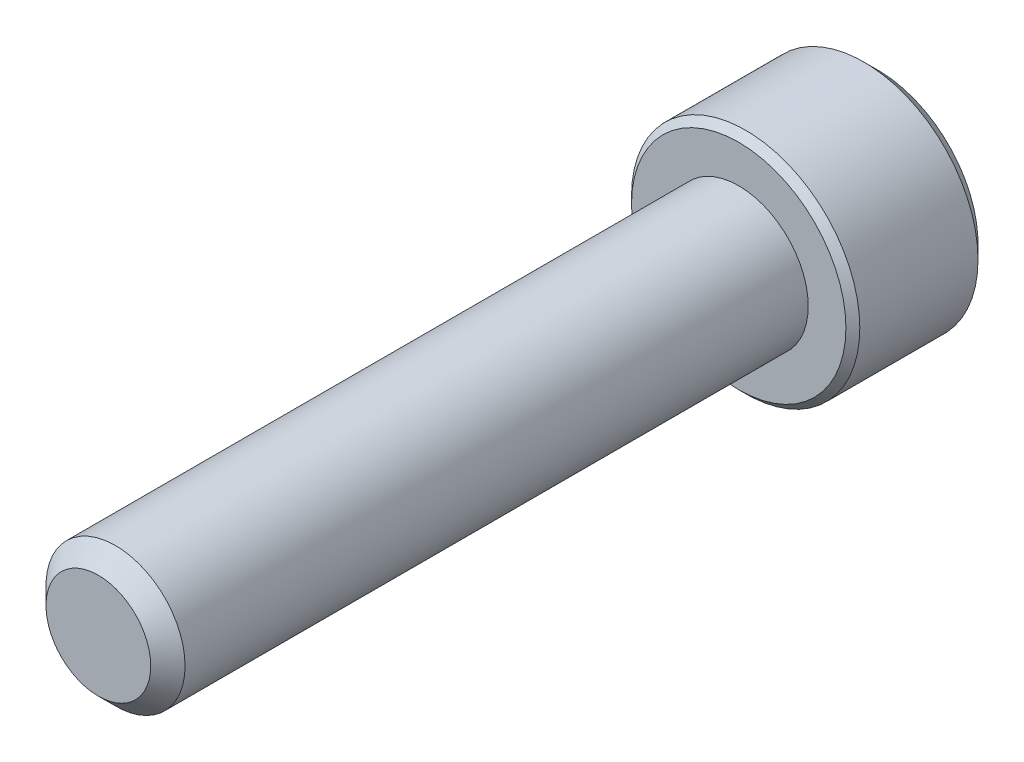
ISO-10303-21;
HEADER;
FILE_DESCRIPTION(('STEP AP214'),'2;1');
FILE_NAME('part.step','',(''),(''),'','','');
FILE_SCHEMA(('AUTOMOTIVE_DESIGN { 1 0 10303 214 1 1 1 1 }'));
ENDSEC;
DATA;
#1=APPLICATION_CONTEXT('core data for automotive mechanical design processes');
#2=APPLICATION_PROTOCOL_DEFINITION('international standard','automotive_design',2000,#1);
#3=PRODUCT_CONTEXT('',#1,'mechanical');
#4=PRODUCT('Part','Part','',(#3));
#5=PRODUCT_RELATED_PRODUCT_CATEGORY('part','',(#4));
#6=PRODUCT_DEFINITION_FORMATION('','',#4);
#7=PRODUCT_DEFINITION_CONTEXT('part definition',#1,'design');
#8=PRODUCT_DEFINITION('design','',#6,#7);
#9=PRODUCT_DEFINITION_SHAPE('','',#8);
#10=(LENGTH_UNIT() NAMED_UNIT(*) SI_UNIT(.MILLI.,.METRE.));
#11=(NAMED_UNIT(*) PLANE_ANGLE_UNIT() SI_UNIT($,.RADIAN.));
#12=(NAMED_UNIT(*) SI_UNIT($,.STERADIAN.) SOLID_ANGLE_UNIT());
#13=UNCERTAINTY_MEASURE_WITH_UNIT(LENGTH_MEASURE(1.E-05),#10,'distance_accuracy_value','');
#14=(GEOMETRIC_REPRESENTATION_CONTEXT(3) GLOBAL_UNCERTAINTY_ASSIGNED_CONTEXT((#13)) GLOBAL_UNIT_ASSIGNED_CONTEXT((#10,
#11,#12)) REPRESENTATION_CONTEXT('',''));
#15=CARTESIAN_POINT('',(0.,0.,0.));
#16=DIRECTION('',(0.,0.,1.));
#17=DIRECTION('',(1.,0.,0.));
#18=AXIS2_PLACEMENT_3D('',#15,#16,#17);
#19=CARTESIAN_POINT('',(0.,0.,-22.225));
#20=DIRECTION('',(0.,0.,1.));
#21=DIRECTION('',(1.,0.,0.));
#22=AXIS2_PLACEMENT_3D('',#19,#20,#21);
#23=CYLINDRICAL_SURFACE('',#22,2.413);
#24=CARTESIAN_POINT('',(0.,0.,-0.5953125));
#25=DIRECTION('',(0.,0.,1.));
#26=DIRECTION('',(1.,0.,0.));
#27=AXIS2_PLACEMENT_3D('',#24,#25,#26);
#28=CIRCLE('',#27,2.413);
#29=CARTESIAN_POINT('',(2.413,0.,-0.5953125));
#30=VERTEX_POINT('',#29);
#31=EDGE_CURVE('E108',#30,#30,#28,.F.);
#32=ORIENTED_EDGE('',*,*,#31,.T.);
#33=EDGE_LOOP('',(#32));
#34=FACE_BOUND('',#33,.T.);
#35=CARTESIAN_POINT('',(0.,0.,-22.225));
#36=DIRECTION('',(0.,0.,-1.));
#37=DIRECTION('',(-1.,0.,0.));
#38=AXIS2_PLACEMENT_3D('',#35,#36,#37);
#39=CIRCLE('',#38,2.413);
#40=CARTESIAN_POINT('',(-2.413,0.,-22.225));
#41=VERTEX_POINT('',#40);
#42=EDGE_CURVE('E208',#41,#41,#39,.F.);
#43=ORIENTED_EDGE('',*,*,#42,.T.);
#44=EDGE_LOOP('',(#43));
#45=FACE_BOUND('',#44,.T.);
#46=ADVANCED_FACE('F34',(#34,#45),#23,.T.);
#47=CARTESIAN_POINT('',(0.,0.,0.));
#48=DIRECTION('',(0.,0.,1.));
#49=DIRECTION('',(1.,0.,0.));
#50=AXIS2_PLACEMENT_3D('',#47,#48,#49);
#51=PLANE('',#50);
#52=CARTESIAN_POINT('',(0.,0.,0.));
#53=DIRECTION('',(0.,0.,1.));
#54=DIRECTION('',(1.,0.,0.));
#55=AXIS2_PLACEMENT_3D('',#52,#53,#54);
#56=CIRCLE('',#55,1.81768750000001);
#57=CARTESIAN_POINT('',(1.81768750000001,0.,0.));
#58=VERTEX_POINT('',#57);
#59=EDGE_CURVE('E207',#58,#58,#56,.T.);
#60=ORIENTED_EDGE('',*,*,#59,.T.);
#61=EDGE_LOOP('',(#60));
#62=FACE_BOUND('',#61,.T.);
#63=ADVANCED_FACE('F185',(#62),#51,.T.);
#64=CARTESIAN_POINT('',(0.,0.,0.));
#65=DIRECTION('',(0.,0.,-1.));
#66=DIRECTION('',(-1.,0.,0.));
#67=AXIS2_PLACEMENT_3D('',#64,#65,#66);
#68=CONICAL_SURFACE('',#67,1.81768750000001,0.785398163397444);
#69=ORIENTED_EDGE('',*,*,#31,.F.);
#70=EDGE_LOOP('',(#69));
#71=FACE_BOUND('',#70,.T.);
#72=ORIENTED_EDGE('',*,*,#59,.F.);
#73=EDGE_LOOP('',(#72));
#74=FACE_BOUND('',#73,.T.);
#75=ADVANCED_FACE('F191',(#71,#74),#68,.T.);
#76=CARTESIAN_POINT('',(0.,0.,-27.051));
#77=DIRECTION('',(0.,0.,1.));
#78=DIRECTION('',(1.,0.,0.));
#79=AXIS2_PLACEMENT_3D('',#76,#77,#78);
#80=CYLINDRICAL_SURFACE('',#79,3.9624);
#81=CARTESIAN_POINT('',(0.,0.,-22.4663));
#82=DIRECTION('',(0.,0.,-1.));
#83=DIRECTION('',(-1.,0.,0.));
#84=AXIS2_PLACEMENT_3D('',#81,#82,#83);
#85=CIRCLE('',#84,3.9624);
#86=CARTESIAN_POINT('',(-3.9624,0.,-22.4663));
#87=VERTEX_POINT('',#86);
#88=EDGE_CURVE('E42',#87,#87,#85,.T.);
#89=ORIENTED_EDGE('',*,*,#88,.T.);
#90=EDGE_LOOP('',(#89));
#91=FACE_BOUND('',#90,.T.);
#92=CARTESIAN_POINT('',(0.,0.,-26.5684));
#93=DIRECTION('',(0.,0.,-1.));
#94=DIRECTION('',(-1.,0.,0.));
#95=AXIS2_PLACEMENT_3D('',#92,#93,#94);
#96=CIRCLE('',#95,3.9624);
#97=CARTESIAN_POINT('',(-3.9624,0.,-26.5684));
#98=VERTEX_POINT('',#97);
#99=EDGE_CURVE('E168',#98,#98,#96,.F.);
#100=ORIENTED_EDGE('',*,*,#99,.T.);
#101=EDGE_LOOP('',(#100));
#102=FACE_BOUND('',#101,.T.);
#103=ADVANCED_FACE('F173',(#91,#102),#80,.T.);
#104=CARTESIAN_POINT('',(0.,0.,-27.051));
#105=DIRECTION('',(0.,0.,-1.));
#106=DIRECTION('',(-1.,0.,0.));
#107=AXIS2_PLACEMENT_3D('',#104,#105,#106);
#108=PLANE('',#107);
#109=CARTESIAN_POINT('',(0.,0.,-27.051));
#110=DIRECTION('',(0.,0.,-1.));
#111=DIRECTION('',(-1.,0.,0.));
#112=AXIS2_PLACEMENT_3D('',#109,#110,#111);
#113=CIRCLE('',#112,3.4798);
#114=CARTESIAN_POINT('',(-3.4798,0.,-27.051));
#115=VERTEX_POINT('',#114);
#116=EDGE_CURVE('E107',#115,#115,#113,.T.);
#117=ORIENTED_EDGE('',*,*,#116,.T.);
#118=EDGE_LOOP('',(#117));
#119=FACE_BOUND('',#118,.T.);
#120=CARTESIAN_POINT('',(0.,0.,-27.051));
#121=DIRECTION('',(0.,0.,-1.));
#122=DIRECTION('',(-1.,0.,0.));
#123=AXIS2_PLACEMENT_3D('',#120,#121,#122);
#124=CIRCLE('',#123,2.29135888084633);
#125=CARTESIAN_POINT('',(-1.984375,1.14567944042316,-27.051));
#126=VERTEX_POINT('',#125);
#127=CARTESIAN_POINT('',(0.,2.29135888084633,-27.051));
#128=VERTEX_POINT('',#127);
#129=EDGE_CURVE('E88',#126,#128,#124,.T.);
#130=ORIENTED_EDGE('',*,*,#129,.F.);
#131=CARTESIAN_POINT('',(-1.984375,-1.14567944042316,-27.051));
#132=VERTEX_POINT('',#131);
#133=EDGE_CURVE('E48',#132,#126,#124,.T.);
#134=ORIENTED_EDGE('',*,*,#133,.F.);
#135=CARTESIAN_POINT('',(0.,-2.29135888084633,-27.051));
#136=VERTEX_POINT('',#135);
#137=EDGE_CURVE('E264',#136,#132,#124,.T.);
#138=ORIENTED_EDGE('',*,*,#137,.F.);
#139=CARTESIAN_POINT('',(1.984375,-1.14567944042316,-27.051));
#140=VERTEX_POINT('',#139);
#141=EDGE_CURVE('E55',#140,#136,#124,.T.);
#142=ORIENTED_EDGE('',*,*,#141,.F.);
#143=CARTESIAN_POINT('',(1.984375,1.14567944042316,-27.051));
#144=VERTEX_POINT('',#143);
#145=EDGE_CURVE('E129',#144,#140,#124,.T.);
#146=ORIENTED_EDGE('',*,*,#145,.F.);
#147=EDGE_CURVE('E97',#128,#144,#124,.T.);
#148=ORIENTED_EDGE('',*,*,#147,.F.);
#149=EDGE_LOOP('',(#130,#134,#138,#142,#146,#148));
#150=FACE_BOUND('',#149,.T.);
#151=ADVANCED_FACE('F128',(#119,#150),#108,.T.);
#152=CARTESIAN_POINT('',(0.,0.,-22.225));
#153=DIRECTION('',(0.,0.,-1.));
#154=DIRECTION('',(-1.,0.,0.));
#155=AXIS2_PLACEMENT_3D('',#152,#153,#154);
#156=PLANE('',#155);
#157=CARTESIAN_POINT('',(0.,0.,-22.225));
#158=DIRECTION('',(0.,0.,-1.));
#159=DIRECTION('',(-1.,0.,0.));
#160=AXIS2_PLACEMENT_3D('',#157,#158,#159);
#161=CIRCLE('',#160,3.7211);
#162=CARTESIAN_POINT('',(-3.7211,0.,-22.225));
#163=VERTEX_POINT('',#162);
#164=EDGE_CURVE('E11',#163,#163,#161,.F.);
#165=ORIENTED_EDGE('',*,*,#164,.T.);
#166=EDGE_LOOP('',(#165));
#167=FACE_BOUND('',#166,.T.);
#168=ORIENTED_EDGE('',*,*,#42,.F.);
#169=EDGE_LOOP('',(#168));
#170=FACE_BOUND('',#169,.T.);
#171=ADVANCED_FACE('F276',(#167,#170),#156,.F.);
#172=CARTESIAN_POINT('',(0.,0.,-27.051));
#173=DIRECTION('',(0.,0.,-1.));
#174=DIRECTION('',(-1.,0.,0.));
#175=AXIS2_PLACEMENT_3D('',#172,#173,#174);
#176=CONICAL_SURFACE('',#175,2.29135888084633,0.78539816339745);
#177=ORIENTED_EDGE('',*,*,#147,.T.);
#178=CARTESIAN_POINT('',(-0.000199999999999783,2.29147435090016,-27.0511154787818));
#179=CARTESIAN_POINT('',(0.0680159951668029,2.25208982772757,-27.0117628522639));
#180=CARTESIAN_POINT('',(0.137372685106966,2.21204672412052,-26.9747213104462));
#181=CARTESIAN_POINT('',(0.278798800452187,2.13039431835551,-26.9068988584233));
#182=CARTESIAN_POINT('',(0.350881678736782,2.08877724917394,-26.8761556890917));
#183=CARTESIAN_POINT('',(0.496233397266003,2.00485839535392,-26.8234918888112));
#184=CARTESIAN_POINT('',(0.569465212486938,1.96257798712287,-26.80143887588));
#185=CARTESIAN_POINT('',(0.717541182594705,1.87708628592063,-26.7674614929439));
#186=CARTESIAN_POINT('',(0.792380812753423,1.83387760530244,-26.7555117560917));
#187=CARTESIAN_POINT('',(0.921360414543814,1.75941119748879,-26.7447300990819));
#188=CARTESIAN_POINT('',(0.975333715772441,1.72824969749539,-26.7431338990591));
#189=CARTESIAN_POINT('',(1.0831921185198,1.66597761963484,-26.7458218388653));
#190=CARTESIAN_POINT('',(1.13707718248552,1.63486706344893,-26.7501080403405));
#191=CARTESIAN_POINT('',(1.2443385382486,1.57293969082547,-26.7643168730135));
#192=CARTESIAN_POINT('',(1.29771419276014,1.54212324232506,-26.7742458104523));
#193=CARTESIAN_POINT('',(1.40354251740889,1.48102323060122,-26.7991950842745));
#194=CARTESIAN_POINT('',(1.4559952579711,1.45073962671789,-26.8142150303895));
#195=CARTESIAN_POINT('',(1.59035733896365,1.37316564308797,-26.8588078516357));
#196=CARTESIAN_POINT('',(1.67143335715832,1.32635638215845,-26.8917429959383));
#197=CARTESIAN_POINT('',(1.79064830672984,1.25752759893191,-26.9473424412022));
#198=CARTESIAN_POINT('',(1.829934924386,1.23484545965257,-26.9668775920519));
#199=CARTESIAN_POINT('',(1.90778036186805,1.18990137536713,-27.0077287381194));
#200=CARTESIAN_POINT('',(1.9463396111017,1.16763918244233,-27.0290436395683));
#201=CARTESIAN_POINT('',(1.984575,1.14556397036933,-27.0511154787818));
#202=B_SPLINE_CURVE_WITH_KNOTS('',3,(#178,#179,#180,#181,#182,#183,#184,#185,#186,#187,#188,
#189,#190,#191,#192,#193,#194,#195,#196,#197,#198,#199,#200,#201),.UNSPECIFIED.,.F.,.F.,(4,2,2,
2,2,2,2,2,2,2,2,4),(0.,0.264339630306627,0.530219665093693,0.791876416371458,1.05287424418109,
1.239639843932,1.42647091743852,1.61351120244034,1.8005371524754,2.09764209964316,
2.24579179873713,2.39385111134157),.UNSPECIFIED.);
#203=EDGE_CURVE('E102',#128,#144,#202,.T.);
#204=ORIENTED_EDGE('',*,*,#203,.F.);
#205=EDGE_LOOP('',(#177,#204));
#206=FACE_BOUND('',#205,.T.);
#207=ADVANCED_FACE('F103',(#206),#176,.F.);
#208=ORIENTED_EDGE('',*,*,#145,.T.);
#209=CARTESIAN_POINT('',(1.984375,-2.32063167832104,-27.8130122932909));
#210=CARTESIAN_POINT('',(1.984375,-2.26428478873706,-27.7701970726396));
#211=CARTESIAN_POINT('',(1.984375,-2.2076264404859,-27.7277851548598));
#212=CARTESIAN_POINT('',(1.984375,-2.09356244120113,-27.6439497614));
#213=CARTESIAN_POINT('',(1.984375,-2.03615660973826,-27.6025265314735));
#214=CARTESIAN_POINT('',(1.984375,-1.92005329549412,-27.5205556074651));
#215=CARTESIAN_POINT('',(1.984375,-1.86134925442762,-27.4800171714072));
#216=CARTESIAN_POINT('',(1.984375,-1.74295108528238,-27.4004176949279));
#217=CARTESIAN_POINT('',(1.984375,-1.68325702692775,-27.3613565510951));
#218=CARTESIAN_POINT('',(1.984375,-1.5591477373167,-27.282782507283));
#219=CARTESIAN_POINT('',(1.984375,-1.49466231059306,-27.2433799217084));
#220=CARTESIAN_POINT('',(1.984375,-1.36418150680543,-27.1671153086969));
#221=CARTESIAN_POINT('',(1.984375,-1.29818586193375,-27.1302537365827));
#222=CARTESIAN_POINT('',(1.984375,-1.16468832197213,-27.0598663044257));
#223=CARTESIAN_POINT('',(1.984375,-1.09719175474905,-27.0263304185629));
#224=CARTESIAN_POINT('',(1.984375,-0.960326048760515,-26.963338388333));
#225=CARTESIAN_POINT('',(1.984375,-0.890957548524544,-26.9338808733092));
#226=CARTESIAN_POINT('',(1.984375,-0.756350570592778,-26.8824431504383));
#227=CARTESIAN_POINT('',(1.984375,-0.691277091834668,-26.8600356001922));
#228=CARTESIAN_POINT('',(1.984375,-0.559532244342489,-26.8204364385489));
#229=CARTESIAN_POINT('',(1.984375,-0.492860768840822,-26.8032451767239));
#230=CARTESIAN_POINT('',(1.984375,-0.359444340541036,-26.7752733107239));
#231=CARTESIAN_POINT('',(1.984375,-0.292723272440599,-26.7643806612626));
#232=CARTESIAN_POINT('',(1.984375,-0.158528474608845,-26.7492231339064));
#233=CARTESIAN_POINT('',(1.984375,-0.0910548851817863,-26.7449570406579));
#234=CARTESIAN_POINT('',(1.984375,0.0413650999137279,-26.7433854095573));
#235=CARTESIAN_POINT('',(1.984375,0.106308452967822,-26.7458174039186));
#236=CARTESIAN_POINT('',(1.984375,0.23565586300794,-26.7569201379429));
#237=CARTESIAN_POINT('',(1.984375,0.300059868095338,-26.7655914711624));
#238=CARTESIAN_POINT('',(1.984375,0.42895328396465,-26.7888407434725));
#239=CARTESIAN_POINT('',(1.984375,0.493424050458165,-26.8035204588315));
#240=CARTESIAN_POINT('',(1.984375,0.620952380240788,-26.8379955658159));
#241=CARTESIAN_POINT('',(1.984375,0.684010048840139,-26.8577905748402));
#242=CARTESIAN_POINT('',(1.984375,0.88094055855013,-26.9271008914478));
#243=CARTESIAN_POINT('',(1.984375,1.01205007104083,-26.984443011978));
#244=CARTESIAN_POINT('',(1.984375,1.26813381475398,-27.1119796743044));
#245=CARTESIAN_POINT('',(1.984375,1.39308407238678,-27.1822200707537));
#246=CARTESIAN_POINT('',(1.984375,1.57369086911653,-27.2918624553678));
#247=CARTESIAN_POINT('',(1.984375,1.63130328190224,-27.3281057512345));
#248=CARTESIAN_POINT('',(1.984375,1.74553911378007,-27.4021304425414));
#249=CARTESIAN_POINT('',(1.984375,1.80216245776213,-27.4399119540746));
#250=CARTESIAN_POINT('',(1.984375,1.91409137785657,-27.5164208659108));
#251=CARTESIAN_POINT('',(1.984375,1.96940390829638,-27.5551381432783));
#252=CARTESIAN_POINT('',(1.984375,2.07927192346538,-27.633601965305));
#253=CARTESIAN_POINT('',(1.984375,2.13382761241393,-27.6733482236772));
#254=CARTESIAN_POINT('',(1.984375,2.18806621147869,-27.7135161819212));
#255=B_SPLINE_CURVE_WITH_KNOTS('',3,(#209,#210,#211,#212,#213,#214,#215,#216,#217,#218,#219,
#220,#221,#222,#223,#224,#225,#226,#227,#228,#229,#230,#231,#232,#233,#234,#235,#236,#237,#238,
#239,#240,#241,#242,#243,#244,#245,#246,#247,#248,#249,#250,#251,#252,#253,#254),.UNSPECIFIED.,
.F.,.F.,(4,2,2,2,2,2,2,2,2,2,2,2,2,2,2,2,2,2,2,2,2,2,4),(0.,0.212308206697439,0.424668647567404,
0.638672731709378,0.852661807620631,1.07932739837561,1.30603350019038,1.53203394142883,
1.75795824321728,1.96424818305224,2.170551944454,2.37306294924567,2.57553680780813,
2.77019069742987,2.96486310718306,3.16297934082809,3.36108076055064,3.78913334543008,
4.21873824519345,4.4229122671498,4.62710172729377,4.8296395612553,5.03212163744055),.UNSPECIFIED.);
#256=EDGE_CURVE('E96',#144,#140,#255,.F.);
#257=ORIENTED_EDGE('',*,*,#256,.F.);
#258=EDGE_LOOP('',(#208,#257));
#259=FACE_BOUND('',#258,.T.);
#260=ADVANCED_FACE('F270',(#259),#176,.F.);
#261=ORIENTED_EDGE('',*,*,#141,.T.);
#262=CARTESIAN_POINT('',(1.984575,-1.14556397036933,-27.0511154787818));
#263=CARTESIAN_POINT('',(1.9163590048332,-1.18494849354192,-27.0117628522639));
#264=CARTESIAN_POINT('',(1.84700231489303,-1.22499159714897,-26.9747213104462));
#265=CARTESIAN_POINT('',(1.70557619954781,-1.30664400291398,-26.9068988584233));
#266=CARTESIAN_POINT('',(1.63349332126322,-1.34826107209555,-26.8761556890917));
#267=CARTESIAN_POINT('',(1.488141602734,-1.43217992591557,-26.8234918888112));
#268=CARTESIAN_POINT('',(1.41490978751306,-1.47446033414662,-26.80143887588));
#269=CARTESIAN_POINT('',(1.2668338174053,-1.55995203534886,-26.7674614929439));
#270=CARTESIAN_POINT('',(1.19199418724658,-1.60316071596705,-26.7555117560917));
#271=CARTESIAN_POINT('',(1.06301458545619,-1.6776271237807,-26.7447300990819));
#272=CARTESIAN_POINT('',(1.00904128422756,-1.7087886237741,-26.7431338990591));
#273=CARTESIAN_POINT('',(0.901182881480202,-1.77106070163465,-26.7458218388653));
#274=CARTESIAN_POINT('',(0.847297817514479,-1.80217125782056,-26.7501080403405));
#275=CARTESIAN_POINT('',(0.740036461751398,-1.86409863044402,-26.7643168730135));
#276=CARTESIAN_POINT('',(0.686660807239862,-1.89491507894443,-26.7742458104523));
#277=CARTESIAN_POINT('',(0.580832482591105,-1.95601509066827,-26.7991950842745));
#278=CARTESIAN_POINT('',(0.5283797420289,-1.9862986945516,-26.8142150303895));
#279=CARTESIAN_POINT('',(0.394017661036352,-2.06387267818152,-26.8588078516357));
#280=CARTESIAN_POINT('',(0.312941642841677,-2.11068193911104,-26.8917429959383));
#281=CARTESIAN_POINT('',(0.193726693270161,-2.17951072233758,-26.9473424412022));
#282=CARTESIAN_POINT('',(0.154440075614,-2.20219286161692,-26.9668775920519));
#283=CARTESIAN_POINT('',(0.0765946381319477,-2.24713694590237,-27.0077287381194));
#284=CARTESIAN_POINT('',(0.0380353888983016,-2.26939913882716,-27.0290436395683));
#285=CARTESIAN_POINT('',(-0.000199999999999664,-2.29147435090017,-27.0511154787818));
#286=B_SPLINE_CURVE_WITH_KNOTS('',3,(#262,#263,#264,#265,#266,#267,#268,#269,#270,#271,#272,
#273,#274,#275,#276,#277,#278,#279,#280,#281,#282,#283,#284,#285),.UNSPECIFIED.,.F.,.F.,(4,2,2,
2,2,2,2,2,2,2,2,4),(0.,0.264339630306627,0.530219665093693,0.791876416371457,1.05287424418109,
1.239639843932,1.42647091743852,1.61351120244034,1.8005371524754,2.09764209964316,
2.24579179873713,2.39385111134157),.UNSPECIFIED.);
#287=EDGE_CURVE('E138',#140,#136,#286,.T.);
#288=ORIENTED_EDGE('',*,*,#287,.F.);
#289=EDGE_LOOP('',(#261,#288));
#290=FACE_BOUND('',#289,.T.);
#291=ADVANCED_FACE('F267',(#290),#176,.F.);
#292=ORIENTED_EDGE('',*,*,#137,.T.);
#293=CARTESIAN_POINT('',(0.000200000000000106,-2.29147435090016,-27.0511154787818));
#294=CARTESIAN_POINT('',(-0.0680159951668025,-2.25208982772757,-27.0117628522639));
#295=CARTESIAN_POINT('',(-0.137372685106966,-2.21204672412052,-26.9747213104462));
#296=CARTESIAN_POINT('',(-0.278798800452187,-2.13039431835551,-26.9068988584233));
#297=CARTESIAN_POINT('',(-0.350881678736782,-2.08877724917394,-26.8761556890917));
#298=CARTESIAN_POINT('',(-0.496233397266003,-2.00485839535392,-26.8234918888112));
#299=CARTESIAN_POINT('',(-0.569465212486937,-1.96257798712287,-26.80143887588));
#300=CARTESIAN_POINT('',(-0.717541182594705,-1.87708628592063,-26.7674614929439));
#301=CARTESIAN_POINT('',(-0.792380812753423,-1.83387760530244,-26.7555117560917));
#302=CARTESIAN_POINT('',(-0.921360414543814,-1.75941119748879,-26.7447300990819));
#303=CARTESIAN_POINT('',(-0.975333715772441,-1.72824969749539,-26.7431338990591));
#304=CARTESIAN_POINT('',(-1.0831921185198,-1.66597761963484,-26.7458218388653));
#305=CARTESIAN_POINT('',(-1.13707718248552,-1.63486706344893,-26.7501080403405));
#306=CARTESIAN_POINT('',(-1.2443385382486,-1.57293969082547,-26.7643168730135));
#307=CARTESIAN_POINT('',(-1.29771419276014,-1.54212324232506,-26.7742458104523));
#308=CARTESIAN_POINT('',(-1.40354251740889,-1.48102323060122,-26.7991950842745));
#309=CARTESIAN_POINT('',(-1.4559952579711,-1.45073962671789,-26.8142150303895));
#310=CARTESIAN_POINT('',(-1.59035733896365,-1.37316564308797,-26.8588078516357));
#311=CARTESIAN_POINT('',(-1.67143335715832,-1.32635638215845,-26.8917429959383));
#312=CARTESIAN_POINT('',(-1.79064830672984,-1.25752759893191,-26.9473424412022));
#313=CARTESIAN_POINT('',(-1.829934924386,-1.23484545965257,-26.9668775920519));
#314=CARTESIAN_POINT('',(-1.90778036186805,-1.18990137536713,-27.0077287381194));
#315=CARTESIAN_POINT('',(-1.9463396111017,-1.16763918244233,-27.0290436395683));
#316=CARTESIAN_POINT('',(-1.984575,-1.14556397036933,-27.0511154787818));
#317=B_SPLINE_CURVE_WITH_KNOTS('',3,(#293,#294,#295,#296,#297,#298,#299,#300,#301,#302,#303,
#304,#305,#306,#307,#308,#309,#310,#311,#312,#313,#314,#315,#316),.UNSPECIFIED.,.F.,.F.,(4,2,2,
2,2,2,2,2,2,2,2,4),(0.,0.264339630306627,0.530219665093693,0.791876416371458,1.05287424418109,
1.239639843932,1.42647091743852,1.61351120244034,1.8005371524754,2.09764209964316,
2.24579179873713,2.39385111134157),.UNSPECIFIED.);
#318=EDGE_CURVE('E242',#136,#132,#317,.T.);
#319=ORIENTED_EDGE('',*,*,#318,.F.);
#320=EDGE_LOOP('',(#292,#319));
#321=FACE_BOUND('',#320,.T.);
#322=ADVANCED_FACE('F266',(#321),#176,.F.);
#323=ORIENTED_EDGE('',*,*,#133,.T.);
#324=CARTESIAN_POINT('',(-1.984375,-2.32063167841241,-27.8130122933603));
#325=CARTESIAN_POINT('',(-1.984375,-2.26428478882584,-27.7701970727064));
#326=CARTESIAN_POINT('',(-1.984375,-2.20762644057208,-27.7277851549239));
#327=CARTESIAN_POINT('',(-1.984375,-2.09356244128209,-27.6439497614587));
#328=CARTESIAN_POINT('',(-1.984375,-2.03615660981659,-27.6025265315296));
#329=CARTESIAN_POINT('',(-1.984375,-1.92005329556713,-27.5205556075158));
#330=CARTESIAN_POINT('',(-1.984375,-1.86134925449792,-27.4800171714553));
#331=CARTESIAN_POINT('',(-1.984375,-1.74295108534721,-27.4004176949706));
#332=CARTESIAN_POINT('',(-1.984375,-1.68325702698981,-27.3613565511353));
#333=CARTESIAN_POINT('',(-1.984375,-1.55914773737281,-27.2827825073177));
#334=CARTESIAN_POINT('',(-1.984375,-1.49466231064596,-27.2433799217402));
#335=CARTESIAN_POINT('',(-1.984375,-1.36418150685181,-27.1671153087231));
#336=CARTESIAN_POINT('',(-1.984375,-1.29818586197682,-27.1302537366062));
#337=CARTESIAN_POINT('',(-1.984375,-1.16468832200844,-27.059866304444));
#338=CARTESIAN_POINT('',(-1.984375,-1.09719175478193,-27.0263304185787));
#339=CARTESIAN_POINT('',(-1.984375,-0.96032604878634,-26.9633383883442));
#340=CARTESIAN_POINT('',(-1.984375,-0.890957548546747,-26.9338808733182));
#341=CARTESIAN_POINT('',(-1.984375,-0.756350570613434,-26.8824431504457));
#342=CARTESIAN_POINT('',(-1.984375,-0.691277091857558,-26.8600356001998));
#343=CARTESIAN_POINT('',(-1.984375,-0.559532244369926,-26.8204364385565));
#344=CARTESIAN_POINT('',(-1.984375,-0.49286076887057,-26.8032451767311));
#345=CARTESIAN_POINT('',(-1.984375,-0.359444340575333,-26.7752733107301));
#346=CARTESIAN_POINT('',(-1.984375,-0.292723272477133,-26.764380661268));
#347=CARTESIAN_POINT('',(-1.984375,-0.158528474649782,-26.7492231339098));
#348=CARTESIAN_POINT('',(-1.984375,-0.0910548852248899,-26.7449570406599));
#349=CARTESIAN_POINT('',(-1.984375,0.0413650998667354,-26.7433854095564));
#350=CARTESIAN_POINT('',(-1.984375,0.106308452919102,-26.7458174039161));
#351=CARTESIAN_POINT('',(-1.984375,0.235655862955944,-26.7569201379368));
#352=CARTESIAN_POINT('',(-1.984375,0.300059868041793,-26.7655914711544));
#353=CARTESIAN_POINT('',(-1.984375,0.428953283908048,-26.7888407434606));
#354=CARTESIAN_POINT('',(-1.984375,0.493424050400059,-26.8035204588175));
#355=CARTESIAN_POINT('',(-1.984375,0.620952380179825,-26.8379955657978));
#356=CARTESIAN_POINT('',(-1.984375,0.684010048777823,-26.8577905748199));
#357=CARTESIAN_POINT('',(-1.984375,0.880940558474363,-26.9271008914176));
#358=CARTESIAN_POINT('',(-1.984375,1.01205007095364,-26.9844430119387));
#359=CARTESIAN_POINT('',(-1.984375,1.26813381464482,-27.1119796742459));
#360=CARTESIAN_POINT('',(-1.984375,1.39308407226708,-27.182220070685));
#361=CARTESIAN_POINT('',(-1.984375,1.5736908689822,-27.2918624552844));
#362=CARTESIAN_POINT('',(-1.984375,1.63130328176363,-27.3281057511465));
#363=CARTESIAN_POINT('',(-1.984375,1.74553911363297,-27.4021304424442));
#364=CARTESIAN_POINT('',(-1.984375,1.80216245761082,-27.4399119539729));
#365=CARTESIAN_POINT('',(-1.984375,1.91409137769693,-27.5164208658));
#366=CARTESIAN_POINT('',(-1.984375,1.96940390813262,-27.5551381431629));
#367=CARTESIAN_POINT('',(-1.984375,2.07927192329343,-27.6336019651806));
#368=CARTESIAN_POINT('',(-1.984375,2.13382761223789,-27.6733482235483));
#369=CARTESIAN_POINT('',(-1.984375,2.18806621129857,-27.7135161817877));
#370=B_SPLINE_CURVE_WITH_KNOTS('',3,(#324,#325,#326,#327,#328,#329,#330,#331,#332,#333,#334,
#335,#336,#337,#338,#339,#340,#341,#342,#343,#344,#345,#346,#347,#348,#349,#350,#351,#352,#353,
#354,#355,#356,#357,#358,#359,#360,#361,#362,#363,#364,#365,#366,#367,#368,#369),.UNSPECIFIED.,
.F.,.F.,(4,2,2,2,2,2,2,2,2,2,2,2,2,2,2,2,2,2,2,2,2,2,4),(0.,0.212308206708487,0.424668647589499,
0.638672731742732,0.852661807665247,1.07932739843287,1.30603350026028,1.53203394151127,
1.75795824331225,1.96424818314072,2.170551944536,2.37306294932147,2.57553680787772,
2.77019069749411,2.96486310724195,3.16297934088121,3.36108076059799,3.78913334543527,
4.2187382451562,4.42291226709441,4.62710172722024,4.82963956116388,5.03212163733123),.UNSPECIFIED.);
#371=EDGE_CURVE('E118',#132,#126,#370,.T.);
#372=ORIENTED_EDGE('',*,*,#371,.F.);
#373=EDGE_LOOP('',(#323,#372));
#374=FACE_BOUND('',#373,.T.);
#375=ADVANCED_FACE('F283',(#374),#176,.F.);
#376=ORIENTED_EDGE('',*,*,#129,.T.);
#377=CARTESIAN_POINT('',(-1.984575,1.14556397036933,-27.0511154787818));
#378=CARTESIAN_POINT('',(-1.9163590048332,1.18494849354192,-27.0117628522639));
#379=CARTESIAN_POINT('',(-1.84700231489303,1.22499159714897,-26.9747213104462));
#380=CARTESIAN_POINT('',(-1.70557619954781,1.30664400291398,-26.9068988584233));
#381=CARTESIAN_POINT('',(-1.63349332126322,1.34826107209555,-26.8761556890917));
#382=CARTESIAN_POINT('',(-1.488141602734,1.43217992591557,-26.8234918888112));
#383=CARTESIAN_POINT('',(-1.41490978751306,1.47446033414662,-26.80143887588));
#384=CARTESIAN_POINT('',(-1.2668338174053,1.55995203534886,-26.7674614929439));
#385=CARTESIAN_POINT('',(-1.19199418724658,1.60316071596705,-26.7555117560917));
#386=CARTESIAN_POINT('',(-1.06301458545619,1.6776271237807,-26.7447300990819));
#387=CARTESIAN_POINT('',(-1.00904128422756,1.7087886237741,-26.7431338990591));
#388=CARTESIAN_POINT('',(-0.901182881480201,1.77106070163465,-26.7458218388653));
#389=CARTESIAN_POINT('',(-0.847297817514479,1.80217125782056,-26.7501080403405));
#390=CARTESIAN_POINT('',(-0.740036461751398,1.86409863044402,-26.7643168730135));
#391=CARTESIAN_POINT('',(-0.686660807239861,1.89491507894443,-26.7742458104523));
#392=CARTESIAN_POINT('',(-0.580832482591105,1.95601509066827,-26.7991950842745));
#393=CARTESIAN_POINT('',(-0.528379742028901,1.9862986945516,-26.8142150303895));
#394=CARTESIAN_POINT('',(-0.394017661036353,2.06387267818152,-26.8588078516357));
#395=CARTESIAN_POINT('',(-0.312941642841677,2.11068193911104,-26.8917429959383));
#396=CARTESIAN_POINT('',(-0.193726693270162,2.17951072233758,-26.9473424412022));
#397=CARTESIAN_POINT('',(-0.154440075614001,2.20219286161692,-26.9668775920519));
#398=CARTESIAN_POINT('',(-0.0765946381319491,2.24713694590236,-27.0077287381194));
#399=CARTESIAN_POINT('',(-0.0380353888983022,2.26939913882716,-27.0290436395683));
#400=CARTESIAN_POINT('',(0.000200000000000052,2.29147435090017,-27.0511154787818));
#401=B_SPLINE_CURVE_WITH_KNOTS('',3,(#377,#378,#379,#380,#381,#382,#383,#384,#385,#386,#387,
#388,#389,#390,#391,#392,#393,#394,#395,#396,#397,#398,#399,#400),.UNSPECIFIED.,.F.,.F.,(4,2,2,
2,2,2,2,2,2,2,2,4),(0.,0.264339630306626,0.530219665093693,0.791876416371457,1.05287424418109,
1.239639843932,1.42647091743852,1.61351120244034,1.8005371524754,2.09764209964316,
2.24579179873713,2.39385111134157),.UNSPECIFIED.);
#402=EDGE_CURVE('E92',#126,#128,#401,.T.);
#403=ORIENTED_EDGE('',*,*,#402,.F.);
#404=EDGE_LOOP('',(#376,#403));
#405=FACE_BOUND('',#404,.T.);
#406=ADVANCED_FACE('F90',(#405),#176,.F.);
#407=CARTESIAN_POINT('',(1.984375,3.43703832126949,-24.0744375));
#408=DIRECTION('',(0.,0.,-1.));
#409=DIRECTION('',(-1.,0.,0.));
#410=AXIS2_PLACEMENT_3D('',#407,#408,#409);
#411=PLANE('',#410);
#412=DIRECTION('',(0.866025403784439,0.5,0.));
#413=VECTOR('',#412,1.);
#414=CARTESIAN_POINT('',(-1.984375,1.14567944042316,-24.0744375));
#415=LINE('',#414,#413);
#416=CARTESIAN_POINT('',(-1.984375,1.14567944042316,-24.0744375));
#417=VERTEX_POINT('',#416);
#418=CARTESIAN_POINT('',(0.,2.29135888084633,-24.0744375));
#419=VERTEX_POINT('',#418);
#420=EDGE_CURVE('E117',#417,#419,#415,.T.);
#421=ORIENTED_EDGE('',*,*,#420,.T.);
#422=DIRECTION('',(0.866025403784439,-0.5,0.));
#423=VECTOR('',#422,1.);
#424=CARTESIAN_POINT('',(0.,2.29135888084633,-24.0744375));
#425=LINE('',#424,#423);
#426=CARTESIAN_POINT('',(1.984375,1.14567944042316,-24.0744375));
#427=VERTEX_POINT('',#426);
#428=EDGE_CURVE('E122',#419,#427,#425,.T.);
#429=ORIENTED_EDGE('',*,*,#428,.T.);
#430=DIRECTION('',(0.,-1.,0.));
#431=VECTOR('',#430,1.);
#432=CARTESIAN_POINT('',(1.984375,1.14567944042316,-24.0744375));
#433=LINE('',#432,#431);
#434=CARTESIAN_POINT('',(1.984375,-1.14567944042316,-24.0744375));
#435=VERTEX_POINT('',#434);
#436=EDGE_CURVE('E230',#427,#435,#433,.T.);
#437=ORIENTED_EDGE('',*,*,#436,.T.);
#438=DIRECTION('',(-0.866025403784439,-0.5,0.));
#439=VECTOR('',#438,1.);
#440=CARTESIAN_POINT('',(1.984375,-1.14567944042316,-24.0744375));
#441=LINE('',#440,#439);
#442=CARTESIAN_POINT('',(0.,-2.29135888084633,-24.0744375));
#443=VERTEX_POINT('',#442);
#444=EDGE_CURVE('E227',#435,#443,#441,.T.);
#445=ORIENTED_EDGE('',*,*,#444,.T.);
#446=DIRECTION('',(-0.866025403784439,0.5,0.));
#447=VECTOR('',#446,1.);
#448=CARTESIAN_POINT('',(0.,-2.29135888084633,-24.0744375));
#449=LINE('',#448,#447);
#450=CARTESIAN_POINT('',(-1.984375,-1.14567944042316,-24.0744375));
#451=VERTEX_POINT('',#450);
#452=EDGE_CURVE('E224',#443,#451,#449,.T.);
#453=ORIENTED_EDGE('',*,*,#452,.T.);
#454=DIRECTION('',(0.,1.,0.));
#455=VECTOR('',#454,1.);
#456=CARTESIAN_POINT('',(-1.984375,-1.14567944042316,-24.0744375));
#457=LINE('',#456,#455);
#458=EDGE_CURVE('E125',#451,#417,#457,.T.);
#459=ORIENTED_EDGE('',*,*,#458,.T.);
#460=EDGE_LOOP('',(#421,#429,#437,#445,#453,#459));
#461=FACE_BOUND('',#460,.T.);
#462=ADVANCED_FACE('F157',(#461),#411,.T.);
#463=CARTESIAN_POINT('',(0.,2.29135888084633,-24.0744375));
#464=DIRECTION('',(0.5,0.866025403784439,0.));
#465=DIRECTION('',(-0.866025403784439,0.5,0.));
#466=AXIS2_PLACEMENT_3D('',#463,#464,#465);
#467=PLANE('',#466);
#468=DIRECTION('',(0.,0.,-1.));
#469=VECTOR('',#468,1.);
#470=CARTESIAN_POINT('',(0.,2.29135888084633,-24.0744375));
#471=LINE('',#470,#469);
#472=EDGE_CURVE('E114',#419,#128,#471,.T.);
#473=ORIENTED_EDGE('',*,*,#472,.T.);
#474=ORIENTED_EDGE('',*,*,#203,.T.);
#475=DIRECTION('',(0.,0.,-1.));
#476=VECTOR('',#475,1.);
#477=CARTESIAN_POINT('',(1.984375,1.14567944042316,-24.0744375));
#478=LINE('',#477,#476);
#479=EDGE_CURVE('E124',#427,#144,#478,.T.);
#480=ORIENTED_EDGE('',*,*,#479,.F.);
#481=ORIENTED_EDGE('',*,*,#428,.F.);
#482=EDGE_LOOP('',(#473,#474,#480,#481));
#483=FACE_BOUND('',#482,.T.);
#484=ADVANCED_FACE('F120',(#483),#467,.F.);
#485=CARTESIAN_POINT('',(1.984375,1.14567944042316,-24.0744375));
#486=DIRECTION('',(1.,0.,0.));
#487=DIRECTION('',(0.,0.,-1.));
#488=AXIS2_PLACEMENT_3D('',#485,#486,#487);
#489=PLANE('',#488);
#490=ORIENTED_EDGE('',*,*,#479,.T.);
#491=ORIENTED_EDGE('',*,*,#256,.T.);
#492=DIRECTION('',(0.,0.,-1.));
#493=VECTOR('',#492,1.);
#494=CARTESIAN_POINT('',(1.984375,-1.14567944042316,-24.0744375));
#495=LINE('',#494,#493);
#496=EDGE_CURVE('E213',#435,#140,#495,.T.);
#497=ORIENTED_EDGE('',*,*,#496,.F.);
#498=ORIENTED_EDGE('',*,*,#436,.F.);
#499=EDGE_LOOP('',(#490,#491,#497,#498));
#500=FACE_BOUND('',#499,.T.);
#501=ADVANCED_FACE('F146',(#500),#489,.F.);
#502=CARTESIAN_POINT('',(1.984375,-1.14567944042316,-24.0744375));
#503=DIRECTION('',(0.5,-0.866025403784439,0.));
#504=DIRECTION('',(0.866025403784439,0.5,0.));
#505=AXIS2_PLACEMENT_3D('',#502,#503,#504);
#506=PLANE('',#505);
#507=ORIENTED_EDGE('',*,*,#496,.T.);
#508=ORIENTED_EDGE('',*,*,#287,.T.);
#509=DIRECTION('',(0.,0.,-1.));
#510=VECTOR('',#509,1.);
#511=CARTESIAN_POINT('',(0.,-2.29135888084633,-24.0744375));
#512=LINE('',#511,#510);
#513=EDGE_CURVE('E216',#443,#136,#512,.T.);
#514=ORIENTED_EDGE('',*,*,#513,.F.);
#515=ORIENTED_EDGE('',*,*,#444,.F.);
#516=EDGE_LOOP('',(#507,#508,#514,#515));
#517=FACE_BOUND('',#516,.T.);
#518=ADVANCED_FACE('F150',(#517),#506,.F.);
#519=CARTESIAN_POINT('',(0.,-2.29135888084633,-24.0744375));
#520=DIRECTION('',(-0.5,-0.866025403784439,0.));
#521=DIRECTION('',(0.866025403784439,-0.5,0.));
#522=AXIS2_PLACEMENT_3D('',#519,#520,#521);
#523=PLANE('',#522);
#524=ORIENTED_EDGE('',*,*,#513,.T.);
#525=ORIENTED_EDGE('',*,*,#318,.T.);
#526=DIRECTION('',(0.,0.,-1.));
#527=VECTOR('',#526,1.);
#528=CARTESIAN_POINT('',(-1.984375,-1.14567944042316,-24.0744375));
#529=LINE('',#528,#527);
#530=EDGE_CURVE('E219',#451,#132,#529,.T.);
#531=ORIENTED_EDGE('',*,*,#530,.F.);
#532=ORIENTED_EDGE('',*,*,#452,.F.);
#533=EDGE_LOOP('',(#524,#525,#531,#532));
#534=FACE_BOUND('',#533,.T.);
#535=ADVANCED_FACE('F249',(#534),#523,.F.);
#536=CARTESIAN_POINT('',(-1.984375,-1.14567944042316,-24.0744375));
#537=DIRECTION('',(-1.,0.,0.));
#538=DIRECTION('',(0.,-1.,0.));
#539=AXIS2_PLACEMENT_3D('',#536,#537,#538);
#540=PLANE('',#539);
#541=ORIENTED_EDGE('',*,*,#530,.T.);
#542=ORIENTED_EDGE('',*,*,#371,.T.);
#543=DIRECTION('',(0.,0.,-1.));
#544=VECTOR('',#543,1.);
#545=CARTESIAN_POINT('',(-1.984375,1.14567944042316,-24.0744375));
#546=LINE('',#545,#544);
#547=EDGE_CURVE('E116',#417,#126,#546,.T.);
#548=ORIENTED_EDGE('',*,*,#547,.F.);
#549=ORIENTED_EDGE('',*,*,#458,.F.);
#550=EDGE_LOOP('',(#541,#542,#548,#549));
#551=FACE_BOUND('',#550,.T.);
#552=ADVANCED_FACE('F246',(#551),#540,.F.);
#553=CARTESIAN_POINT('',(-1.984375,1.14567944042316,-24.0744375));
#554=DIRECTION('',(-0.5,0.866025403784439,0.));
#555=DIRECTION('',(-0.866025403784439,-0.5,0.));
#556=AXIS2_PLACEMENT_3D('',#553,#554,#555);
#557=PLANE('',#556);
#558=ORIENTED_EDGE('',*,*,#547,.T.);
#559=ORIENTED_EDGE('',*,*,#402,.T.);
#560=ORIENTED_EDGE('',*,*,#472,.F.);
#561=ORIENTED_EDGE('',*,*,#420,.F.);
#562=EDGE_LOOP('',(#558,#559,#560,#561));
#563=FACE_BOUND('',#562,.T.);
#564=ADVANCED_FACE('F112',(#563),#557,.F.);
#565=CARTESIAN_POINT('',(0.,0.,-27.051));
#566=DIRECTION('',(0.,0.,1.));
#567=DIRECTION('',(1.,0.,0.));
#568=AXIS2_PLACEMENT_3D('',#565,#566,#567);
#569=CONICAL_SURFACE('',#568,3.4798,0.785398163397447);
#570=ORIENTED_EDGE('',*,*,#99,.F.);
#571=EDGE_LOOP('',(#570));
#572=FACE_BOUND('',#571,.T.);
#573=ORIENTED_EDGE('',*,*,#116,.F.);
#574=EDGE_LOOP('',(#573));
#575=FACE_BOUND('',#574,.T.);
#576=ADVANCED_FACE('F177',(#572,#575),#569,.T.);
#577=CARTESIAN_POINT('',(0.,0.,-22.4663));
#578=DIRECTION('',(0.,0.,-1.));
#579=DIRECTION('',(-1.,0.,0.));
#580=AXIS2_PLACEMENT_3D('',#577,#578,#579);
#581=CONICAL_SURFACE('',#580,3.9624,0.785398163397445);
#582=CARTESIAN_POINT('',(-3.7211,0.,-22.225));
#583=CARTESIAN_POINT('',(-3.72361354166666,0.,-22.2275135416667));
#584=CARTESIAN_POINT('',(-3.72612708333333,0.,-22.2300270833333));
#585=CARTESIAN_POINT('',(-3.73115416666666,0.,-22.2350541666667));
#586=CARTESIAN_POINT('',(-3.73366770833333,0.,-22.2375677083333));
#587=CARTESIAN_POINT('',(-3.73869479166666,0.,-22.2425947916667));
#588=CARTESIAN_POINT('',(-3.74120833333333,0.,-22.2451083333333));
#589=CARTESIAN_POINT('',(-3.74623541666666,0.,-22.2501354166667));
#590=CARTESIAN_POINT('',(-3.74874895833333,0.,-22.2526489583333));
#591=CARTESIAN_POINT('',(-3.75377604166666,0.,-22.2576760416667));
#592=CARTESIAN_POINT('',(-3.75628958333333,0.,-22.2601895833333));
#593=CARTESIAN_POINT('',(-3.76131666666666,0.,-22.2652166666667));
#594=CARTESIAN_POINT('',(-3.76383020833333,0.,-22.2677302083333));
#595=CARTESIAN_POINT('',(-3.76885729166666,0.,-22.2727572916667));
#596=CARTESIAN_POINT('',(-3.77137083333333,0.,-22.2752708333333));
#597=CARTESIAN_POINT('',(-3.77639791666666,0.,-22.2802979166667));
#598=CARTESIAN_POINT('',(-3.77891145833333,0.,-22.2828114583333));
#599=CARTESIAN_POINT('',(-3.78393854166666,0.,-22.2878385416667));
#600=CARTESIAN_POINT('',(-3.78645208333333,0.,-22.2903520833333));
#601=CARTESIAN_POINT('',(-3.79147916666666,0.,-22.2953791666667));
#602=CARTESIAN_POINT('',(-3.79399270833333,0.,-22.2978927083333));
#603=CARTESIAN_POINT('',(-3.79901979166666,0.,-22.3029197916667));
#604=CARTESIAN_POINT('',(-3.80153333333333,0.,-22.3054333333333));
#605=CARTESIAN_POINT('',(-3.80656041666666,0.,-22.3104604166667));
#606=CARTESIAN_POINT('',(-3.80907395833333,0.,-22.3129739583333));
#607=CARTESIAN_POINT('',(-3.81410104166666,0.,-22.3180010416667));
#608=CARTESIAN_POINT('',(-3.81661458333333,0.,-22.3205145833333));
#609=CARTESIAN_POINT('',(-3.82164166666666,0.,-22.3255416666667));
#610=CARTESIAN_POINT('',(-3.82415520833333,0.,-22.3280552083333));
#611=CARTESIAN_POINT('',(-3.82918229166666,0.,-22.3330822916667));
#612=CARTESIAN_POINT('',(-3.83169583333333,0.,-22.3355958333333));
#613=CARTESIAN_POINT('',(-3.83672291666666,0.,-22.3406229166667));
#614=CARTESIAN_POINT('',(-3.83923645833333,0.,-22.3431364583333));
#615=CARTESIAN_POINT('',(-3.84426354166666,0.,-22.3481635416667));
#616=CARTESIAN_POINT('',(-3.84677708333333,0.,-22.3506770833333));
#617=CARTESIAN_POINT('',(-3.85180416666666,0.,-22.3557041666667));
#618=CARTESIAN_POINT('',(-3.85431770833333,0.,-22.3582177083333));
#619=CARTESIAN_POINT('',(-3.85934479166666,0.,-22.3632447916667));
#620=CARTESIAN_POINT('',(-3.86185833333333,0.,-22.3657583333333));
#621=CARTESIAN_POINT('',(-3.86688541666666,0.,-22.3707854166667));
#622=CARTESIAN_POINT('',(-3.86939895833333,0.,-22.3732989583333));
#623=CARTESIAN_POINT('',(-3.87442604166666,0.,-22.3783260416667));
#624=CARTESIAN_POINT('',(-3.87693958333333,0.,-22.3808395833333));
#625=CARTESIAN_POINT('',(-3.88196666666666,0.,-22.3858666666667));
#626=CARTESIAN_POINT('',(-3.88448020833333,0.,-22.3883802083333));
#627=CARTESIAN_POINT('',(-3.88950729166666,0.,-22.3934072916667));
#628=CARTESIAN_POINT('',(-3.89202083333333,0.,-22.3959208333333));
#629=CARTESIAN_POINT('',(-3.89704791666666,0.,-22.4009479166667));
#630=CARTESIAN_POINT('',(-3.89956145833333,0.,-22.4034614583333));
#631=CARTESIAN_POINT('',(-3.90458854166666,0.,-22.4084885416667));
#632=CARTESIAN_POINT('',(-3.90710208333333,0.,-22.4110020833333));
#633=CARTESIAN_POINT('',(-3.91212916666666,0.,-22.4160291666667));
#634=CARTESIAN_POINT('',(-3.91464270833333,0.,-22.4185427083333));
#635=CARTESIAN_POINT('',(-3.91966979166666,0.,-22.4235697916667));
#636=CARTESIAN_POINT('',(-3.92218333333333,0.,-22.4260833333333));
#637=CARTESIAN_POINT('',(-3.92721041666666,0.,-22.4311104166667));
#638=CARTESIAN_POINT('',(-3.92972395833333,0.,-22.4336239583333));
#639=CARTESIAN_POINT('',(-3.93475104166666,0.,-22.4386510416667));
#640=CARTESIAN_POINT('',(-3.93726458333333,0.,-22.4411645833333));
#641=CARTESIAN_POINT('',(-3.94229166666666,0.,-22.4461916666667));
#642=CARTESIAN_POINT('',(-3.94480520833333,0.,-22.4487052083333));
#643=CARTESIAN_POINT('',(-3.94983229166666,0.,-22.4537322916667));
#644=CARTESIAN_POINT('',(-3.95234583333333,0.,-22.4562458333333));
#645=CARTESIAN_POINT('',(-3.95737291666667,0.,-22.4612729166667));
#646=CARTESIAN_POINT('',(-3.95988645833333,0.,-22.4637864583333));
#647=CARTESIAN_POINT('',(-3.9624,0.,-22.4663));
#648=B_SPLINE_CURVE_WITH_KNOTS('',3,(#582,#583,#584,#585,#586,#587,#588,#589,#590,#591,#592,
#593,#594,#595,#596,#597,#598,#599,#600,#601,#602,#603,#604,#605,#606,#607,#608,#609,#610,#611,
#612,#613,#614,#615,#616,#617,#618,#619,#620,#621,#622,#623,#624,#625,#626,#627,#628,#629,#630,
#631,#632,#633,#634,#635,#636,#637,#638,#639,#640,#641,#642,#643,#644,#645,#646,#647),
.UNSPECIFIED.,.F.,.F.,(4,2,2,2,2,2,2,2,2,2,2,2,2,2,2,2,2,2,2,2,2,2,2,2,2,2,2,2,2,2,2,2,4),(0.,
0.0106640541437696,0.0213281082875392,0.0319921624313088,0.0426562165750785,0.0533202707188484,
0.063984324862618,0.0746483790063876,0.0853124331501572,0.0959764872939269,0.106640541437696,
0.117304595581466,0.127968649725236,0.138632703869006,0.149296758012775,0.159960812156545,
0.170624866300314,0.181288920444084,0.191952974587854,0.202617028731623,0.213281082875393,
0.223945137019163,0.234609191162932,0.245273245306702,0.255937299450472,0.266601353594242,
0.277265407738011,0.287929461881781,0.298593516025551,0.30925757016932,0.31992162431309,
0.330585678456859,0.341249732600631),.UNSPECIFIED.);
#649=EDGE_CURVE('BSEAM36',#163,#87,#648,.T.);
#650=ORIENTED_EDGE('',*,*,#164,.F.);
#651=ORIENTED_EDGE('',*,*,#88,.F.);
#652=ORIENTED_EDGE('',*,*,#649,.T.);
#653=ORIENTED_EDGE('',*,*,#649,.F.);
#654=EDGE_LOOP('',(#650,#652,#651,#653));
#655=FACE_BOUND('',#654,.T.);
#656=ADVANCED_FACE('F36',(#655),#581,.T.);
#657=CLOSED_SHELL('',(#46,#63,#75,#103,#151,#171,#207,#260,#291,#322,#375,#406,#462,#484,#501,
#518,#535,#552,#564,#576,#656));
#658=MANIFOLD_SOLID_BREP('B2',#657);
#659=ADVANCED_BREP_SHAPE_REPRESENTATION('',(#18,#658),#14);
#660=SHAPE_DEFINITION_REPRESENTATION(#9,#659);
ENDSEC;
END-ISO-10303-21;
